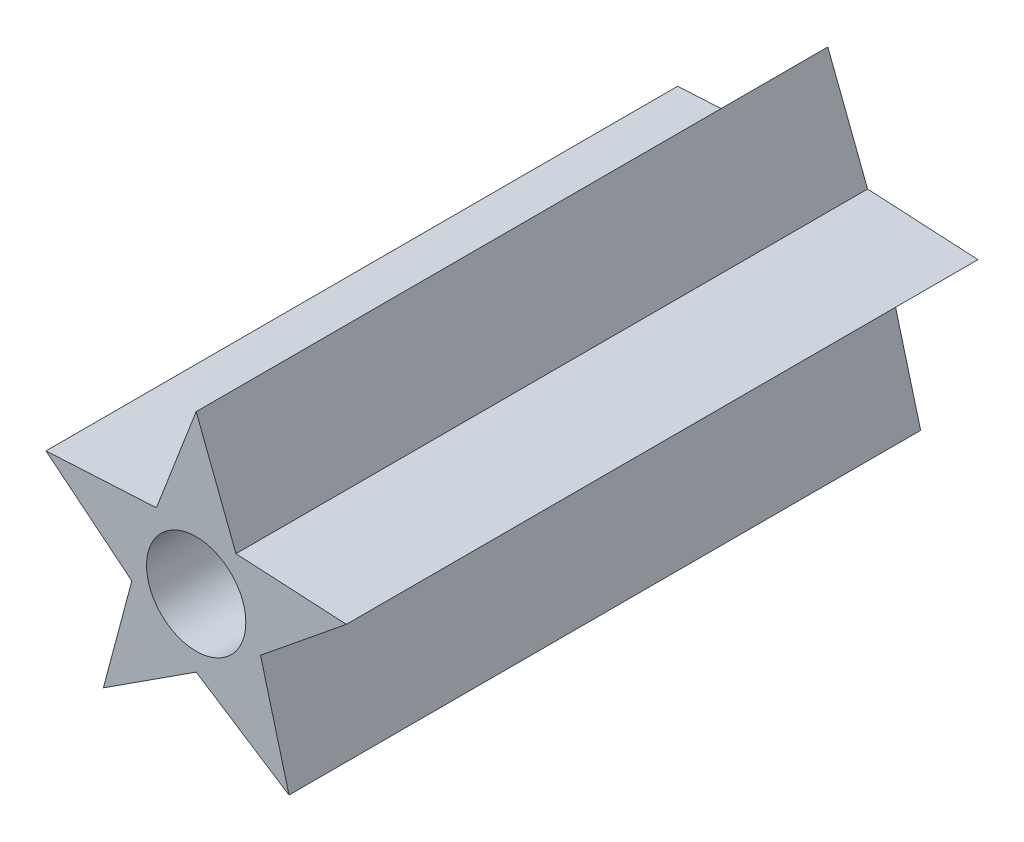
ISO-10303-21;
HEADER;
FILE_DESCRIPTION(('STEP AP214'),'2;1');
FILE_NAME('part.step','',(''),(''),'','','');
FILE_SCHEMA(('AUTOMOTIVE_DESIGN { 1 0 10303 214 1 1 1 1 }'));
ENDSEC;
DATA;
#1=APPLICATION_CONTEXT('core data for automotive mechanical design processes');
#2=APPLICATION_PROTOCOL_DEFINITION('international standard','automotive_design',2000,#1);
#3=PRODUCT_CONTEXT('',#1,'mechanical');
#4=PRODUCT('Part','Part','',(#3));
#5=PRODUCT_RELATED_PRODUCT_CATEGORY('part','',(#4));
#6=PRODUCT_DEFINITION_FORMATION('','',#4);
#7=PRODUCT_DEFINITION_CONTEXT('part definition',#1,'design');
#8=PRODUCT_DEFINITION('design','',#6,#7);
#9=PRODUCT_DEFINITION_SHAPE('','',#8);
#10=(LENGTH_UNIT() NAMED_UNIT(*) SI_UNIT(.MILLI.,.METRE.));
#11=(NAMED_UNIT(*) PLANE_ANGLE_UNIT() SI_UNIT($,.RADIAN.));
#12=(NAMED_UNIT(*) SI_UNIT($,.STERADIAN.) SOLID_ANGLE_UNIT());
#13=UNCERTAINTY_MEASURE_WITH_UNIT(LENGTH_MEASURE(1.E-05),#10,'distance_accuracy_value','');
#14=(GEOMETRIC_REPRESENTATION_CONTEXT(3) GLOBAL_UNCERTAINTY_ASSIGNED_CONTEXT((#13)) GLOBAL_UNIT_ASSIGNED_CONTEXT((#10,
#11,#12)) REPRESENTATION_CONTEXT('',''));
#15=CARTESIAN_POINT('',(0.,0.,0.));
#16=DIRECTION('',(0.,0.,1.));
#17=DIRECTION('',(1.,0.,0.));
#18=AXIS2_PLACEMENT_3D('',#15,#16,#17);
#19=CARTESIAN_POINT('',(10.2862419151183,-14.1577974015616,70.));
#20=DIRECTION('',(-0.966317396384969,-0.257353238650255,0.));
#21=DIRECTION('',(0.257353238650255,-0.966317396384969,0.));
#22=AXIS2_PLACEMENT_3D('',#19,#20,#21);
#23=PLANE('',#22);
#24=DIRECTION('',(-0.257353238650255,0.966317396384969,0.));
#25=VECTOR('',#24,1.);
#26=CARTESIAN_POINT('',(10.2862419151183,-14.1577974015616,0.));
#27=LINE('',#26,#25);
#28=CARTESIAN_POINT('',(10.2862419151183,-14.1577974015616,0.));
#29=VERTEX_POINT('',#28);
#30=CARTESIAN_POINT('',(7.13292387221365,-2.3176274578121,0.));
#31=VERTEX_POINT('',#30);
#32=EDGE_CURVE('E141',#29,#31,#27,.T.);
#33=ORIENTED_EDGE('',*,*,#32,.T.);
#34=DIRECTION('',(0.,0.,-1.));
#35=VECTOR('',#34,1.);
#36=CARTESIAN_POINT('',(7.13292387221365,-2.3176274578121,70.));
#37=LINE('',#36,#35);
#38=CARTESIAN_POINT('',(7.13292387221365,-2.3176274578121,70.));
#39=VERTEX_POINT('',#38);
#40=EDGE_CURVE('E11',#39,#31,#37,.T.);
#41=ORIENTED_EDGE('',*,*,#40,.F.);
#42=DIRECTION('',(-0.257353238650255,0.966317396384969,0.));
#43=VECTOR('',#42,1.);
#44=CARTESIAN_POINT('',(10.2862419151183,-14.1577974015616,70.));
#45=LINE('',#44,#43);
#46=CARTESIAN_POINT('',(10.2862419151183,-14.1577974015616,70.));
#47=VERTEX_POINT('',#46);
#48=EDGE_CURVE('E160',#47,#39,#45,.T.);
#49=ORIENTED_EDGE('',*,*,#48,.F.);
#50=DIRECTION('',(0.,0.,-1.));
#51=VECTOR('',#50,1.);
#52=CARTESIAN_POINT('',(10.2862419151183,-14.1577974015616,70.));
#53=LINE('',#52,#51);
#54=EDGE_CURVE('E137',#47,#29,#53,.T.);
#55=ORIENTED_EDGE('',*,*,#54,.T.);
#56=EDGE_LOOP('',(#33,#41,#49,#55));
#57=FACE_BOUND('',#56,.T.);
#58=ADVANCED_FACE('F33',(#57),#23,.F.);
#59=CARTESIAN_POINT('',(7.13292387221365,-2.3176274578121,70.));
#60=DIRECTION('',(-0.630498757327266,0.776190258254233,0.));
#61=DIRECTION('',(-0.776190258254233,-0.630498757327266,0.));
#62=AXIS2_PLACEMENT_3D('',#59,#60,#61);
#63=PLANE('',#62);
#64=DIRECTION('',(0.776190258254233,0.630498757327266,0.));
#65=VECTOR('',#64,1.);
#66=CARTESIAN_POINT('',(7.13292387221365,-2.3176274578121,0.));
#67=LINE('',#66,#65);
#68=CARTESIAN_POINT('',(16.6434890351652,5.40779740156157,0.));
#69=VERTEX_POINT('',#68);
#70=EDGE_CURVE('E144',#31,#69,#67,.T.);
#71=ORIENTED_EDGE('',*,*,#70,.T.);
#72=DIRECTION('',(0.,0.,-1.));
#73=VECTOR('',#72,1.);
#74=CARTESIAN_POINT('',(16.6434890351652,5.40779740156157,70.));
#75=LINE('',#74,#73);
#76=CARTESIAN_POINT('',(16.6434890351652,5.40779740156157,70.));
#77=VERTEX_POINT('',#76);
#78=EDGE_CURVE('E41',#77,#69,#75,.T.);
#79=ORIENTED_EDGE('',*,*,#78,.F.);
#80=DIRECTION('',(0.776190258254233,0.630498757327266,0.));
#81=VECTOR('',#80,1.);
#82=CARTESIAN_POINT('',(7.13292387221365,-2.3176274578121,70.));
#83=LINE('',#82,#81);
#84=EDGE_CURVE('E98',#39,#77,#83,.T.);
#85=ORIENTED_EDGE('',*,*,#84,.F.);
#86=ORIENTED_EDGE('',*,*,#40,.T.);
#87=EDGE_LOOP('',(#71,#79,#85,#86));
#88=FACE_BOUND('',#87,.T.);
#89=ADVANCED_FACE('F230',(#88),#63,.F.);
#90=CARTESIAN_POINT('',(16.6434890351652,5.40779740156157,70.));
#91=DIRECTION('',(-0.0538510228351212,-0.998548980941652,0.));
#92=DIRECTION('',(0.998548980941652,-0.0538510228351212,0.));
#93=AXIS2_PLACEMENT_3D('',#90,#91,#92);
#94=PLANE('',#93);
#95=DIRECTION('',(-0.998548980941652,0.0538510228351212,0.));
#96=VECTOR('',#95,1.);
#97=CARTESIAN_POINT('',(16.6434890351652,5.40779740156157,0.));
#98=LINE('',#97,#96);
#99=CARTESIAN_POINT('',(4.40838939219355,6.06762745781211,0.));
#100=VERTEX_POINT('',#99);
#101=EDGE_CURVE('E147',#69,#100,#98,.T.);
#102=ORIENTED_EDGE('',*,*,#101,.T.);
#103=DIRECTION('',(0.,0.,-1.));
#104=VECTOR('',#103,1.);
#105=CARTESIAN_POINT('',(4.40838939219355,6.06762745781211,70.));
#106=LINE('',#105,#104);
#107=CARTESIAN_POINT('',(4.40838939219355,6.06762745781211,70.));
#108=VERTEX_POINT('',#107);
#109=EDGE_CURVE('E173',#108,#100,#106,.T.);
#110=ORIENTED_EDGE('',*,*,#109,.F.);
#111=DIRECTION('',(-0.998548980941652,0.0538510228351212,0.));
#112=VECTOR('',#111,1.);
#113=CARTESIAN_POINT('',(16.6434890351652,5.40779740156157,70.));
#114=LINE('',#113,#112);
#115=EDGE_CURVE('E181',#77,#108,#114,.T.);
#116=ORIENTED_EDGE('',*,*,#115,.F.);
#117=ORIENTED_EDGE('',*,*,#78,.T.);
#118=EDGE_LOOP('',(#102,#110,#116,#117));
#119=FACE_BOUND('',#118,.T.);
#120=ADVANCED_FACE('F179',(#119),#94,.F.);
#121=CARTESIAN_POINT('',(4.40838939219355,6.06762745781211,70.));
#122=DIRECTION('',(-0.933035633943917,-0.359783971003256,0.));
#123=DIRECTION('',(0.359783971003256,-0.933035633943918,0.));
#124=AXIS2_PLACEMENT_3D('',#121,#122,#123);
#125=PLANE('',#124);
#126=DIRECTION('',(-0.359783971003256,0.933035633943918,0.));
#127=VECTOR('',#126,1.);
#128=CARTESIAN_POINT('',(4.40838939219355,6.06762745781211,0.));
#129=LINE('',#128,#127);
#130=CARTESIAN_POINT('',(0.,17.5,0.));
#131=VERTEX_POINT('',#130);
#132=EDGE_CURVE('E149',#100,#131,#129,.T.);
#133=ORIENTED_EDGE('',*,*,#132,.T.);
#134=DIRECTION('',(0.,0.,-1.));
#135=VECTOR('',#134,1.);
#136=CARTESIAN_POINT('',(0.,17.5,70.));
#137=LINE('',#136,#135);
#138=CARTESIAN_POINT('',(0.,17.5,70.));
#139=VERTEX_POINT('',#138);
#140=EDGE_CURVE('E170',#139,#131,#137,.T.);
#141=ORIENTED_EDGE('',*,*,#140,.F.);
#142=DIRECTION('',(-0.359783971003256,0.933035633943918,0.));
#143=VECTOR('',#142,1.);
#144=CARTESIAN_POINT('',(4.40838939219355,6.06762745781211,70.));
#145=LINE('',#144,#143);
#146=EDGE_CURVE('E199',#108,#139,#145,.T.);
#147=ORIENTED_EDGE('',*,*,#146,.F.);
#148=ORIENTED_EDGE('',*,*,#109,.T.);
#149=EDGE_LOOP('',(#133,#141,#147,#148));
#150=FACE_BOUND('',#149,.T.);
#151=ADVANCED_FACE('F190',(#150),#125,.F.);
#152=CARTESIAN_POINT('',(0.,17.5,70.));
#153=DIRECTION('',(0.933035633943917,-0.359783971003257,0.));
#154=DIRECTION('',(0.359783971003257,0.933035633943917,0.));
#155=AXIS2_PLACEMENT_3D('',#152,#153,#154);
#156=PLANE('',#155);
#157=DIRECTION('',(-0.359783971003257,-0.933035633943917,0.));
#158=VECTOR('',#157,1.);
#159=CARTESIAN_POINT('',(0.,17.5,0.));
#160=LINE('',#159,#158);
#161=CARTESIAN_POINT('',(-4.40838939219355,6.06762745781211,0.));
#162=VERTEX_POINT('',#161);
#163=EDGE_CURVE('E151',#131,#162,#160,.T.);
#164=ORIENTED_EDGE('',*,*,#163,.T.);
#165=DIRECTION('',(0.,0.,-1.));
#166=VECTOR('',#165,1.);
#167=CARTESIAN_POINT('',(-4.40838939219355,6.06762745781211,70.));
#168=LINE('',#167,#166);
#169=CARTESIAN_POINT('',(-4.40838939219355,6.06762745781211,70.));
#170=VERTEX_POINT('',#169);
#171=EDGE_CURVE('E167',#170,#162,#168,.T.);
#172=ORIENTED_EDGE('',*,*,#171,.F.);
#173=DIRECTION('',(-0.359783971003257,-0.933035633943917,0.));
#174=VECTOR('',#173,1.);
#175=CARTESIAN_POINT('',(0.,17.5,70.));
#176=LINE('',#175,#174);
#177=EDGE_CURVE('E196',#139,#170,#176,.T.);
#178=ORIENTED_EDGE('',*,*,#177,.F.);
#179=ORIENTED_EDGE('',*,*,#140,.T.);
#180=EDGE_LOOP('',(#164,#172,#178,#179));
#181=FACE_BOUND('',#180,.T.);
#182=ADVANCED_FACE('F194',(#181),#156,.F.);
#183=CARTESIAN_POINT('',(-4.40838939219355,6.06762745781211,70.));
#184=DIRECTION('',(0.0538510228351212,-0.998548980941652,0.));
#185=DIRECTION('',(0.998548980941652,0.0538510228351212,0.));
#186=AXIS2_PLACEMENT_3D('',#183,#184,#185);
#187=PLANE('',#186);
#188=DIRECTION('',(-0.998548980941652,-0.0538510228351212,0.));
#189=VECTOR('',#188,1.);
#190=CARTESIAN_POINT('',(-4.40838939219355,6.06762745781211,0.));
#191=LINE('',#190,#189);
#192=CARTESIAN_POINT('',(-16.6434890351652,5.40779740156157,0.));
#193=VERTEX_POINT('',#192);
#194=EDGE_CURVE('E153',#162,#193,#191,.T.);
#195=ORIENTED_EDGE('',*,*,#194,.T.);
#196=DIRECTION('',(0.,0.,-1.));
#197=VECTOR('',#196,1.);
#198=CARTESIAN_POINT('',(-16.6434890351652,5.40779740156157,70.));
#199=LINE('',#198,#197);
#200=CARTESIAN_POINT('',(-16.6434890351652,5.40779740156157,70.));
#201=VERTEX_POINT('',#200);
#202=EDGE_CURVE('E164',#201,#193,#199,.T.);
#203=ORIENTED_EDGE('',*,*,#202,.F.);
#204=DIRECTION('',(-0.998548980941652,-0.0538510228351212,0.));
#205=VECTOR('',#204,1.);
#206=CARTESIAN_POINT('',(-4.40838939219355,6.06762745781211,70.));
#207=LINE('',#206,#205);
#208=EDGE_CURVE('E198',#170,#201,#207,.T.);
#209=ORIENTED_EDGE('',*,*,#208,.F.);
#210=ORIENTED_EDGE('',*,*,#171,.T.);
#211=EDGE_LOOP('',(#195,#203,#209,#210));
#212=FACE_BOUND('',#211,.T.);
#213=ADVANCED_FACE('F242',(#212),#187,.F.);
#214=CARTESIAN_POINT('',(-16.6434890351652,5.40779740156157,70.));
#215=DIRECTION('',(0.630498757327267,0.776190258254233,0.));
#216=DIRECTION('',(-0.776190258254233,0.630498757327267,0.));
#217=AXIS2_PLACEMENT_3D('',#214,#215,#216);
#218=PLANE('',#217);
#219=DIRECTION('',(0.776190258254233,-0.630498757327267,0.));
#220=VECTOR('',#219,1.);
#221=CARTESIAN_POINT('',(-16.6434890351652,5.40779740156157,0.));
#222=LINE('',#221,#220);
#223=CARTESIAN_POINT('',(-7.13292387221366,-2.31762745781211,0.));
#224=VERTEX_POINT('',#223);
#225=EDGE_CURVE('E155',#193,#224,#222,.T.);
#226=ORIENTED_EDGE('',*,*,#225,.T.);
#227=DIRECTION('',(0.,0.,-1.));
#228=VECTOR('',#227,1.);
#229=CARTESIAN_POINT('',(-7.13292387221366,-2.31762745781211,70.));
#230=LINE('',#229,#228);
#231=CARTESIAN_POINT('',(-7.13292387221366,-2.31762745781211,70.));
#232=VERTEX_POINT('',#231);
#233=EDGE_CURVE('E132',#232,#224,#230,.T.);
#234=ORIENTED_EDGE('',*,*,#233,.F.);
#235=DIRECTION('',(0.776190258254233,-0.630498757327267,0.));
#236=VECTOR('',#235,1.);
#237=CARTESIAN_POINT('',(-16.6434890351652,5.40779740156157,70.));
#238=LINE('',#237,#236);
#239=EDGE_CURVE('E123',#201,#232,#238,.T.);
#240=ORIENTED_EDGE('',*,*,#239,.F.);
#241=ORIENTED_EDGE('',*,*,#202,.T.);
#242=EDGE_LOOP('',(#226,#234,#240,#241));
#243=FACE_BOUND('',#242,.T.);
#244=ADVANCED_FACE('F239',(#243),#218,.F.);
#245=CARTESIAN_POINT('',(-7.13292387221366,-2.31762745781211,70.));
#246=DIRECTION('',(0.966317396384969,-0.257353238650255,0.));
#247=DIRECTION('',(0.257353238650255,0.966317396384969,0.));
#248=AXIS2_PLACEMENT_3D('',#245,#246,#247);
#249=PLANE('',#248);
#250=DIRECTION('',(-0.257353238650255,-0.966317396384969,0.));
#251=VECTOR('',#250,1.);
#252=CARTESIAN_POINT('',(-7.13292387221366,-2.31762745781211,0.));
#253=LINE('',#252,#251);
#254=CARTESIAN_POINT('',(-10.2862419151183,-14.1577974015616,0.));
#255=VERTEX_POINT('',#254);
#256=EDGE_CURVE('E131',#224,#255,#253,.T.);
#257=ORIENTED_EDGE('',*,*,#256,.T.);
#258=DIRECTION('',(0.,0.,-1.));
#259=VECTOR('',#258,1.);
#260=CARTESIAN_POINT('',(-10.2862419151183,-14.1577974015616,70.));
#261=LINE('',#260,#259);
#262=CARTESIAN_POINT('',(-10.2862419151183,-14.1577974015616,70.));
#263=VERTEX_POINT('',#262);
#264=EDGE_CURVE('E128',#263,#255,#261,.T.);
#265=ORIENTED_EDGE('',*,*,#264,.F.);
#266=DIRECTION('',(-0.257353238650255,-0.966317396384969,0.));
#267=VECTOR('',#266,1.);
#268=CARTESIAN_POINT('',(-7.13292387221366,-2.31762745781211,70.));
#269=LINE('',#268,#267);
#270=EDGE_CURVE('E117',#232,#263,#269,.T.);
#271=ORIENTED_EDGE('',*,*,#270,.F.);
#272=ORIENTED_EDGE('',*,*,#233,.T.);
#273=EDGE_LOOP('',(#257,#265,#271,#272));
#274=FACE_BOUND('',#273,.T.);
#275=ADVANCED_FACE('F129',(#274),#249,.F.);
#276=CARTESIAN_POINT('',(-10.2862419151183,-14.1577974015616,70.));
#277=DIRECTION('',(-0.543365972051095,0.839495932340931,0.));
#278=DIRECTION('',(-0.839495932340931,-0.543365972051095,0.));
#279=AXIS2_PLACEMENT_3D('',#276,#277,#278);
#280=PLANE('',#279);
#281=DIRECTION('',(0.839495932340931,0.543365972051095,0.));
#282=VECTOR('',#281,1.);
#283=CARTESIAN_POINT('',(-10.2862419151183,-14.1577974015616,0.));
#284=LINE('',#283,#282);
#285=CARTESIAN_POINT('',(0.,-7.5,0.));
#286=VERTEX_POINT('',#285);
#287=EDGE_CURVE('E84',#255,#286,#284,.T.);
#288=ORIENTED_EDGE('',*,*,#287,.T.);
#289=DIRECTION('',(0.,0.,-1.));
#290=VECTOR('',#289,1.);
#291=CARTESIAN_POINT('',(0.,-7.5,70.));
#292=LINE('',#291,#290);
#293=CARTESIAN_POINT('',(0.,-7.5,70.));
#294=VERTEX_POINT('',#293);
#295=EDGE_CURVE('E133',#294,#286,#292,.T.);
#296=ORIENTED_EDGE('',*,*,#295,.F.);
#297=DIRECTION('',(0.839495932340931,0.543365972051095,0.));
#298=VECTOR('',#297,1.);
#299=CARTESIAN_POINT('',(-10.2862419151183,-14.1577974015616,70.));
#300=LINE('',#299,#298);
#301=EDGE_CURVE('E121',#263,#294,#300,.T.);
#302=ORIENTED_EDGE('',*,*,#301,.F.);
#303=ORIENTED_EDGE('',*,*,#264,.T.);
#304=EDGE_LOOP('',(#288,#296,#302,#303));
#305=FACE_BOUND('',#304,.T.);
#306=ADVANCED_FACE('F135',(#305),#280,.F.);
#307=CARTESIAN_POINT('',(0.,-7.5,70.));
#308=DIRECTION('',(0.543365972051094,0.839495932340931,0.));
#309=DIRECTION('',(-0.839495932340931,0.543365972051094,0.));
#310=AXIS2_PLACEMENT_3D('',#307,#308,#309);
#311=PLANE('',#310);
#312=DIRECTION('',(0.839495932340931,-0.543365972051094,0.));
#313=VECTOR('',#312,1.);
#314=CARTESIAN_POINT('',(0.,-7.5,0.));
#315=LINE('',#314,#313);
#316=EDGE_CURVE('E90',#286,#29,#315,.T.);
#317=ORIENTED_EDGE('',*,*,#316,.T.);
#318=ORIENTED_EDGE('',*,*,#54,.F.);
#319=DIRECTION('',(0.839495932340931,-0.543365972051094,0.));
#320=VECTOR('',#319,1.);
#321=CARTESIAN_POINT('',(0.,-7.5,70.));
#322=LINE('',#321,#320);
#323=EDGE_CURVE('E49',#294,#47,#322,.T.);
#324=ORIENTED_EDGE('',*,*,#323,.F.);
#325=ORIENTED_EDGE('',*,*,#295,.T.);
#326=EDGE_LOOP('',(#317,#318,#324,#325));
#327=FACE_BOUND('',#326,.T.);
#328=ADVANCED_FACE('F221',(#327),#311,.F.);
#329=CARTESIAN_POINT('',(0.,0.,70.));
#330=DIRECTION('',(0.,0.,1.));
#331=DIRECTION('',(1.,0.,0.));
#332=AXIS2_PLACEMENT_3D('',#329,#330,#331);
#333=PLANE('',#332);
#334=CARTESIAN_POINT('',(0.,0.,70.));
#335=DIRECTION('',(0.,0.,1.));
#336=DIRECTION('',(1.,0.,0.));
#337=AXIS2_PLACEMENT_3D('',#334,#335,#336);
#338=CIRCLE('',#337,5.5);
#339=CARTESIAN_POINT('',(5.5,0.,70.));
#340=VERTEX_POINT('',#339);
#341=EDGE_CURVE('E207',#340,#340,#338,.T.);
#342=ORIENTED_EDGE('',*,*,#341,.F.);
#343=EDGE_LOOP('',(#342));
#344=FACE_BOUND('',#343,.T.);
#345=ORIENTED_EDGE('',*,*,#48,.T.);
#346=ORIENTED_EDGE('',*,*,#84,.T.);
#347=ORIENTED_EDGE('',*,*,#115,.T.);
#348=ORIENTED_EDGE('',*,*,#146,.T.);
#349=ORIENTED_EDGE('',*,*,#177,.T.);
#350=ORIENTED_EDGE('',*,*,#208,.T.);
#351=ORIENTED_EDGE('',*,*,#239,.T.);
#352=ORIENTED_EDGE('',*,*,#270,.T.);
#353=ORIENTED_EDGE('',*,*,#301,.T.);
#354=ORIENTED_EDGE('',*,*,#323,.T.);
#355=EDGE_LOOP('',(#345,#346,#347,#348,#349,#350,#351,#352,#353,#354));
#356=FACE_BOUND('',#355,.T.);
#357=ADVANCED_FACE('F119',(#344,#356),#333,.T.);
#358=CARTESIAN_POINT('',(0.,0.,0.));
#359=DIRECTION('',(0.,0.,1.));
#360=DIRECTION('',(1.,0.,0.));
#361=AXIS2_PLACEMENT_3D('',#358,#359,#360);
#362=PLANE('',#361);
#363=CARTESIAN_POINT('',(0.,0.,0.));
#364=DIRECTION('',(0.,0.,1.));
#365=DIRECTION('',(1.,0.,0.));
#366=AXIS2_PLACEMENT_3D('',#363,#364,#365);
#367=CIRCLE('',#366,5.5);
#368=CARTESIAN_POINT('',(5.5,0.,0.));
#369=VERTEX_POINT('',#368);
#370=EDGE_CURVE('E145',#369,#369,#367,.T.);
#371=ORIENTED_EDGE('',*,*,#370,.T.);
#372=EDGE_LOOP('',(#371));
#373=FACE_BOUND('',#372,.T.);
#374=ORIENTED_EDGE('',*,*,#32,.F.);
#375=ORIENTED_EDGE('',*,*,#316,.F.);
#376=ORIENTED_EDGE('',*,*,#287,.F.);
#377=ORIENTED_EDGE('',*,*,#256,.F.);
#378=ORIENTED_EDGE('',*,*,#225,.F.);
#379=ORIENTED_EDGE('',*,*,#194,.F.);
#380=ORIENTED_EDGE('',*,*,#163,.F.);
#381=ORIENTED_EDGE('',*,*,#132,.F.);
#382=ORIENTED_EDGE('',*,*,#101,.F.);
#383=ORIENTED_EDGE('',*,*,#70,.F.);
#384=EDGE_LOOP('',(#374,#375,#376,#377,#378,#379,#380,#381,#382,#383));
#385=FACE_BOUND('',#384,.T.);
#386=ADVANCED_FACE('F185',(#373,#385),#362,.F.);
#387=CARTESIAN_POINT('',(0.,0.,0.));
#388=DIRECTION('',(0.,0.,1.));
#389=DIRECTION('',(1.,0.,0.));
#390=AXIS2_PLACEMENT_3D('',#387,#388,#389);
#391=CYLINDRICAL_SURFACE('',#390,5.5);
#392=ORIENTED_EDGE('',*,*,#370,.F.);
#393=EDGE_LOOP('',(#392));
#394=FACE_BOUND('',#393,.T.);
#395=ORIENTED_EDGE('',*,*,#341,.T.);
#396=EDGE_LOOP('',(#395));
#397=FACE_BOUND('',#396,.T.);
#398=ADVANCED_FACE('F214',(#394,#397),#391,.F.);
#399=CLOSED_SHELL('',(#58,#89,#120,#151,#182,#213,#244,#275,#306,#328,#357,#386,#398));
#400=MANIFOLD_SOLID_BREP('B2',#399);
#401=ADVANCED_BREP_SHAPE_REPRESENTATION('',(#18,#400),#14);
#402=SHAPE_DEFINITION_REPRESENTATION(#9,#401);
ENDSEC;
END-ISO-10303-21;
